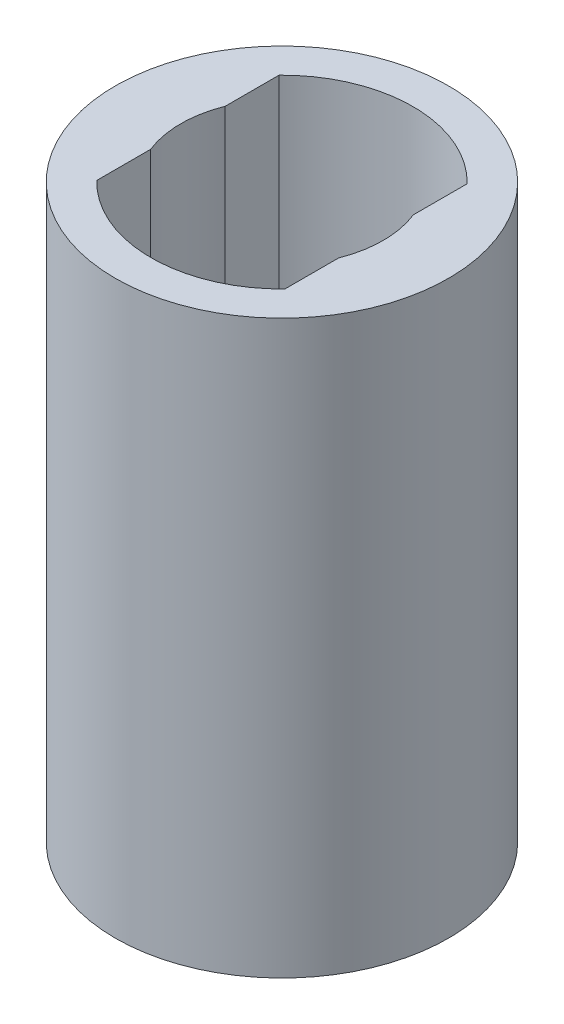
ISO-10303-21;
HEADER;
FILE_DESCRIPTION(('STEP AP214'),'2;1');
FILE_NAME('part.step','',(''),(''),'','','');
FILE_SCHEMA(('AUTOMOTIVE_DESIGN { 1 0 10303 214 1 1 1 1 }'));
ENDSEC;
DATA;
#1=APPLICATION_CONTEXT('core data for automotive mechanical design processes');
#2=APPLICATION_PROTOCOL_DEFINITION('international standard','automotive_design',2000,#1);
#3=PRODUCT_CONTEXT('',#1,'mechanical');
#4=PRODUCT('Part','Part','',(#3));
#5=PRODUCT_RELATED_PRODUCT_CATEGORY('part','',(#4));
#6=PRODUCT_DEFINITION_FORMATION('','',#4);
#7=PRODUCT_DEFINITION_CONTEXT('part definition',#1,'design');
#8=PRODUCT_DEFINITION('design','',#6,#7);
#9=PRODUCT_DEFINITION_SHAPE('','',#8);
#10=(LENGTH_UNIT() NAMED_UNIT(*) SI_UNIT(.MILLI.,.METRE.));
#11=(NAMED_UNIT(*) PLANE_ANGLE_UNIT() SI_UNIT($,.RADIAN.));
#12=(NAMED_UNIT(*) SI_UNIT($,.STERADIAN.) SOLID_ANGLE_UNIT());
#13=UNCERTAINTY_MEASURE_WITH_UNIT(LENGTH_MEASURE(1.E-05),#10,'distance_accuracy_value','');
#14=(GEOMETRIC_REPRESENTATION_CONTEXT(3) GLOBAL_UNCERTAINTY_ASSIGNED_CONTEXT((#13)) GLOBAL_UNIT_ASSIGNED_CONTEXT((#10,
#11,#12)) REPRESENTATION_CONTEXT('',''));
#15=CARTESIAN_POINT('',(0.,0.,0.));
#16=DIRECTION('',(0.,0.,1.));
#17=DIRECTION('',(1.,0.,0.));
#18=AXIS2_PLACEMENT_3D('',#15,#16,#17);
#19=CARTESIAN_POINT('',(0.,12.,0.));
#20=DIRECTION('',(0.,1.,0.));
#21=DIRECTION('',(0.,0.,1.));
#22=AXIS2_PLACEMENT_3D('',#19,#20,#21);
#23=PLANE('',#22);
#24=CARTESIAN_POINT('',(0.,12.,0.));
#25=DIRECTION('',(0.,1.,0.));
#26=DIRECTION('',(0.,0.,1.));
#27=AXIS2_PLACEMENT_3D('',#24,#25,#26);
#28=CIRCLE('',#27,3.5);
#29=CARTESIAN_POINT('',(0.,12.,3.5));
#30=VERTEX_POINT('',#29);
#31=EDGE_CURVE('E205',#30,#30,#28,.T.);
#32=ORIENTED_EDGE('',*,*,#31,.T.);
#33=EDGE_LOOP('',(#32));
#34=FACE_BOUND('',#33,.T.);
#35=CARTESIAN_POINT('',(0.,12.,0.));
#36=DIRECTION('',(0.,1.,0.));
#37=DIRECTION('',(0.,0.,1.));
#38=AXIS2_PLACEMENT_3D('',#35,#36,#37);
#39=CIRCLE('',#38,2.125);
#40=CARTESIAN_POINT('',(1.975,12.,0.784219357067906));
#41=VERTEX_POINT('',#40);
#42=CARTESIAN_POINT('',(1.975,12.,-0.784219357067906));
#43=VERTEX_POINT('',#42);
#44=EDGE_CURVE('E227',#41,#43,#39,.T.);
#45=ORIENTED_EDGE('',*,*,#44,.F.);
#46=DIRECTION('',(0.,0.,1.));
#47=VECTOR('',#46,1.);
#48=CARTESIAN_POINT('',(1.975,12.,-1.91360262332596));
#49=LINE('',#48,#47);
#50=CARTESIAN_POINT('',(1.975,12.,1.91360262332596));
#51=VERTEX_POINT('',#50);
#52=EDGE_CURVE('E151',#41,#51,#49,.T.);
#53=ORIENTED_EDGE('',*,*,#52,.T.);
#54=CARTESIAN_POINT('',(0.,12.,0.));
#55=DIRECTION('',(0.,1.,0.));
#56=DIRECTION('',(0.,0.,1.));
#57=AXIS2_PLACEMENT_3D('',#54,#55,#56);
#58=CIRCLE('',#57,2.75);
#59=CARTESIAN_POINT('',(-1.975,12.,1.91360262332596));
#60=VERTEX_POINT('',#59);
#61=EDGE_CURVE('E125',#60,#51,#58,.T.);
#62=ORIENTED_EDGE('',*,*,#61,.F.);
#63=DIRECTION('',(0.,0.,1.));
#64=VECTOR('',#63,1.);
#65=CARTESIAN_POINT('',(-1.975,12.,-1.91360262332596));
#66=LINE('',#65,#64);
#67=CARTESIAN_POINT('',(-1.975,12.,0.784219357067906));
#68=VERTEX_POINT('',#67);
#69=EDGE_CURVE('E154',#68,#60,#66,.T.);
#70=ORIENTED_EDGE('',*,*,#69,.F.);
#71=CARTESIAN_POINT('',(-1.975,12.,-0.784219357067906));
#72=VERTEX_POINT('',#71);
#73=EDGE_CURVE('E176',#72,#68,#39,.T.);
#74=ORIENTED_EDGE('',*,*,#73,.F.);
#75=CARTESIAN_POINT('',(-1.975,12.,-1.91360262332596));
#76=VERTEX_POINT('',#75);
#77=EDGE_CURVE('E155',#76,#72,#66,.T.);
#78=ORIENTED_EDGE('',*,*,#77,.F.);
#79=CARTESIAN_POINT('',(0.,12.,0.));
#80=DIRECTION('',(0.,1.,0.));
#81=DIRECTION('',(0.,0.,1.));
#82=AXIS2_PLACEMENT_3D('',#79,#80,#81);
#83=CIRCLE('',#82,2.75);
#84=CARTESIAN_POINT('',(1.975,12.,-1.91360262332596));
#85=VERTEX_POINT('',#84);
#86=EDGE_CURVE('E117',#85,#76,#83,.T.);
#87=ORIENTED_EDGE('',*,*,#86,.F.);
#88=EDGE_CURVE('E147',#85,#43,#49,.T.);
#89=ORIENTED_EDGE('',*,*,#88,.T.);
#90=EDGE_LOOP('',(#45,#53,#62,#70,#74,#78,#87,#89));
#91=FACE_BOUND('',#90,.T.);
#92=ADVANCED_FACE('F43',(#34,#91),#23,.T.);
#93=CARTESIAN_POINT('',(0.,0.,0.));
#94=DIRECTION('',(0.,1.,0.));
#95=DIRECTION('',(0.,0.,1.));
#96=AXIS2_PLACEMENT_3D('',#93,#94,#95);
#97=CYLINDRICAL_SURFACE('',#96,2.125);
#98=CARTESIAN_POINT('',(-1.50519932234904,2.69220121742679,-1.5));
#99=CARTESIAN_POINT('',(-1.50520214720211,2.62041917817583,-1.49999869556422));
#100=CARTESIAN_POINT('',(-1.51043595896016,2.54863058740705,-1.49479928653075));
#101=CARTESIAN_POINT('',(-1.53024145830286,2.4077305705508,-1.47450715955429));
#102=CARTESIAN_POINT('',(-1.54483464329734,2.338625697199,-1.45939166366113));
#103=CARTESIAN_POINT('',(-1.58058723578831,2.20568030383637,-1.42058027569236));
#104=CARTESIAN_POINT('',(-1.60167064810974,2.14178915636918,-1.39698318609836));
#105=CARTESIAN_POINT('',(-1.64789262205342,2.01902779024584,-1.34214779894104));
#106=CARTESIAN_POINT('',(-1.67303130718039,1.96015772459195,-1.31090926864008));
#107=CARTESIAN_POINT('',(-1.72989468853986,1.83758581985222,-1.2351963671847));
#108=CARTESIAN_POINT('',(-1.76199325354786,1.77490237479904,-1.18935407137766));
#109=CARTESIAN_POINT('',(-1.8260366691656,1.6572043058703,-1.08848290599274));
#110=CARTESIAN_POINT('',(-1.85798127145173,1.60219956687641,-1.03344239199102));
#111=CARTESIAN_POINT('',(-1.92450086438534,1.4920677111538,-0.904458074000193));
#112=CARTESIAN_POINT('',(-1.95859449433922,1.43852144621071,-0.828891282149028));
#113=CARTESIAN_POINT('',(-2.01945562578145,1.34542280312454,-0.666975493946208));
#114=CARTESIAN_POINT('',(-2.04623805843333,1.30584185543617,-0.580649004938953));
#115=CARTESIAN_POINT('',(-2.08327979379691,1.25182022115827,-0.424445047264864));
#116=CARTESIAN_POINT('',(-2.09605358148365,1.23346665741796,-0.356506608089566));
#117=CARTESIAN_POINT('',(-2.11495838497326,1.20642872578648,-0.217843670146032));
#118=CARTESIAN_POINT('',(-2.12109475724751,1.19773656087757,-0.147121465753948));
#119=CARTESIAN_POINT('',(-2.12619071017568,1.1905127000863,-0.0047540807310221));
#120=CARTESIAN_POINT('',(-2.12513583137594,1.1920014750458,0.0668926701829182));
#121=CARTESIAN_POINT('',(-2.11591327195684,1.20509489975773,0.208792848174512));
#122=CARTESIAN_POINT('',(-2.10774364231233,1.21670232142774,0.279045888062876));
#123=CARTESIAN_POINT('',(-2.08527950768666,1.24897722951158,0.414538535006281));
#124=CARTESIAN_POINT('',(-2.07113741808345,1.26941953681858,0.479858177315479));
#125=CARTESIAN_POINT('',(-2.03780819788247,1.31838959997912,0.605989844868525));
#126=CARTESIAN_POINT('',(-2.01862006287128,1.34691896564671,0.666800969600958));
#127=CARTESIAN_POINT('',(-1.97405855044121,1.41470052132768,0.789586818293232));
#128=CARTESIAN_POINT('',(-1.94823316370999,1.45479569918684,0.850929326950898));
#129=CARTESIAN_POINT('',(-1.89362450736713,1.54269023833625,0.966384529138026));
#130=CARTESIAN_POINT('',(-1.86483813811931,1.59049770342029,1.02048950712952));
#131=CARTESIAN_POINT('',(-1.80085660723649,1.70228330257195,1.13015943797248));
#132=CARTESIAN_POINT('',(-1.76544477380881,1.76762203661552,1.18421498663101));
#133=CARTESIAN_POINT('',(-1.69653041251856,1.90716869114833,1.28098841502435));
#134=CARTESIAN_POINT('',(-1.66302755110806,1.98137505516664,1.32370828020276));
#135=CARTESIAN_POINT('',(-1.60928205888531,2.12014280647028,1.38822895892572));
#136=CARTESIAN_POINT('',(-1.58776035949452,2.18301444787746,1.41258034760095));
#137=CARTESIAN_POINT('',(-1.55095901708055,2.31309783651596,1.45289355014794));
#138=CARTESIAN_POINT('',(-1.5356677294213,2.38030121280369,1.46887103100747));
#139=CARTESIAN_POINT('',(-1.51364914591407,2.51847449835732,1.49156254183296));
#140=CARTESIAN_POINT('',(-1.5070153687162,2.58947705028718,1.49817547967281));
#141=CARTESIAN_POINT('',(-1.50404287364788,2.73190355970013,1.50116249007311));
#142=CARTESIAN_POINT('',(-1.50769903283174,2.80332728982668,1.49754165761262));
#143=CARTESIAN_POINT('',(-1.52323393233648,2.93342095217929,1.48171228745719));
#144=CARTESIAN_POINT('',(-1.53382763612406,2.9924246760013,1.47084159355773));
#145=CARTESIAN_POINT('',(-1.56045447769576,3.10757666696781,1.4425616074715));
#146=CARTESIAN_POINT('',(-1.57649360284325,3.16372171245261,1.42514511576736));
#147=CARTESIAN_POINT('',(-1.62090415298206,3.29839184941678,1.3747308627526));
#148=CARTESIAN_POINT('',(-1.6515142548013,3.37487613642098,1.33826170669245));
#149=CARTESIAN_POINT('',(-1.71640737292594,3.51962435211473,1.25395818007408));
#150=CARTESIAN_POINT('',(-1.75069757289014,3.58787162954087,1.2061013505002));
#151=CARTESIAN_POINT('',(-1.8200427492385,3.71686599410408,1.09874471422828));
#152=CARTESIAN_POINT('',(-1.85509906339844,3.77743178177559,1.03902740697382));
#153=CARTESIAN_POINT('',(-1.92203978164134,3.88825929404485,0.909233916090093));
#154=CARTESIAN_POINT('',(-1.95392869023993,3.93853576276166,0.839172806193109));
#155=CARTESIAN_POINT('',(-2.00710239176216,4.02022034779928,0.701245398051936));
#156=CARTESIAN_POINT('',(-2.02926536113011,4.05334831581606,0.634741202873395));
#157=CARTESIAN_POINT('',(-2.06754330388442,4.109784267101,0.496036748971944));
#158=CARTESIAN_POINT('',(-2.08366185989883,4.13309806840273,0.423839895198628));
#159=CARTESIAN_POINT('',(-2.10848103370621,4.16876251670421,0.275043557722843));
#160=CARTESIAN_POINT('',(-2.11713677493095,4.18104685764086,0.198420355573291));
#161=CARTESIAN_POINT('',(-2.12595995708904,4.19356792341956,0.0437162428034949));
#162=CARTESIAN_POINT('',(-2.12613117331417,4.19381000660968,-0.0343640040149553));
#163=CARTESIAN_POINT('',(-2.11840035054256,4.18284053204754,-0.181299140135758));
#164=CARTESIAN_POINT('',(-2.11131260076514,4.17278422630034,-0.250288774657608));
#165=CARTESIAN_POINT('',(-2.09088925361572,4.1435118670639,-0.385320835037221));
#166=CARTESIAN_POINT('',(-2.07755251542591,4.12429414105097,-0.451362720340538));
#167=CARTESIAN_POINT('',(-2.04515450939805,4.0768818878364,-0.581008837193009));
#168=CARTESIAN_POINT('',(-2.02593186295436,4.04843273752588,-0.644478353074757));
#169=CARTESIAN_POINT('',(-1.98326563201058,3.98383007000776,-0.765782420347459));
#170=CARTESIAN_POINT('',(-1.95982125962299,3.94767511445822,-0.823615916795444));
#171=CARTESIAN_POINT('',(-1.90625355087688,3.86243528971162,-0.941618357635264));
#172=CARTESIAN_POINT('',(-1.87565857831831,3.8122139125918,-1.00075071260575));
#173=CARTESIAN_POINT('',(-1.81294867065013,3.70369583658326,-1.11033351316612));
#174=CARTESIAN_POINT('',(-1.78083078494166,3.64538300163301,-1.16076614733902));
#175=CARTESIAN_POINT('',(-1.71244584101859,3.51118373850898,-1.25989430283723));
#176=CARTESIAN_POINT('',(-1.676360380328,3.43398319387633,-1.30695360256659));
#177=CARTESIAN_POINT('',(-1.61062514198581,3.27018212272423,-1.38715592572015));
#178=CARTESIAN_POINT('',(-1.58095906248886,3.18360626481372,-1.42033440420439));
#179=CARTESIAN_POINT('',(-1.54120225956538,3.02908366652443,-1.46318771508161));
#180=CARTESIAN_POINT('',(-1.52792365333072,2.96309804262376,-1.47689912451371));
#181=CARTESIAN_POINT('',(-1.50993055372185,2.82880691389304,-1.49529564966024));
#182=CARTESIAN_POINT('',(-1.50519663429654,2.76050703182757,-1.50000124126521));
#183=CARTESIAN_POINT('',(-1.50519932234904,2.69220121742679,-1.5));
#184=B_SPLINE_CURVE_WITH_KNOTS('',3,(#98,#99,#100,#101,#102,#103,#104,#105,#106,#107,#108,#109,
#110,#111,#112,#113,#114,#115,#116,#117,#118,#119,#120,#121,#122,#123,#124,#125,#126,#127,#128,
#129,#130,#131,#132,#133,#134,#135,#136,#137,#138,#139,#140,#141,#142,#143,#144,#145,#146,#147,
#148,#149,#150,#151,#152,#153,#154,#155,#156,#157,#158,#159,#160,#161,#162,#163,#164,#165,#166,
#167,#168,#169,#170,#171,#172,#173,#174,#175,#176,#177,#178,#179,#180,#181,#182,#183),
.UNSPECIFIED.,.T.,.F.,(4,2,2,2,2,2,2,2,2,2,2,2,2,2,2,2,2,2,2,2,2,2,2,2,2,2,2,2,2,2,2,2,2,2,2,2,
2,2,2,2,2,2,4),(0.,0.215021266133692,0.430538188916603,0.643621850137448,0.856712002119262,
1.10790624761036,1.35942093373229,1.6538555127781,1.94768421142553,2.16133805058834,
2.37481933968129,2.58873000218012,2.80269928211445,3.01150990409877,3.22036212125895,
3.45260115368762,3.68508582334802,3.95966466351125,4.23419537943179,4.44577979945356,
4.65696693403321,4.87041693558593,5.08376068776422,5.26580461447219,5.4480493543214,
5.7168815364825,5.98624837506959,6.26110751539386,6.53556999411487,6.76722349378129,
6.998739470581,7.23163811483232,7.46443312709081,7.6736973954055,7.88299988198214,
8.09865145849966,8.31434332318605,8.56359350252857,8.81334808019983,9.10399265701981,
9.3938902549199,9.59896539960113,9.80357372293672),.UNSPECIFIED.);
#185=CARTESIAN_POINT('',(-1.50519932234904,2.69220121742679,-1.5));
#186=VERTEX_POINT('',#185);
#187=EDGE_CURVE('E128',#186,#186,#184,.T.);
#188=ORIENTED_EDGE('',*,*,#187,.T.);
#189=EDGE_LOOP('',(#188));
#190=FACE_BOUND('',#189,.T.);
#191=CARTESIAN_POINT('',(0.,0.,0.));
#192=DIRECTION('',(0.,1.,0.));
#193=DIRECTION('',(0.,0.,1.));
#194=AXIS2_PLACEMENT_3D('',#191,#192,#193);
#195=CIRCLE('',#194,2.125);
#196=CARTESIAN_POINT('',(0.,0.,2.125));
#197=VERTEX_POINT('',#196);
#198=EDGE_CURVE('E177',#197,#197,#195,.T.);
#199=ORIENTED_EDGE('',*,*,#198,.F.);
#200=EDGE_LOOP('',(#199));
#201=FACE_BOUND('',#200,.T.);
#202=DIRECTION('',(0.,1.,0.));
#203=VECTOR('',#202,1.);
#204=CARTESIAN_POINT('',(1.975,0.,-0.784219357067906));
#205=LINE('',#204,#203);
#206=CARTESIAN_POINT('',(1.975,7.,-0.784219357067906));
#207=VERTEX_POINT('',#206);
#208=EDGE_CURVE('E11',#207,#43,#205,.T.);
#209=ORIENTED_EDGE('',*,*,#208,.F.);
#210=CARTESIAN_POINT('',(0.,7.,0.));
#211=DIRECTION('',(0.,1.,0.));
#212=DIRECTION('',(0.,0.,1.));
#213=AXIS2_PLACEMENT_3D('',#210,#211,#212);
#214=CIRCLE('',#213,2.125);
#215=CARTESIAN_POINT('',(-1.975,7.,-0.784219357067906));
#216=VERTEX_POINT('',#215);
#217=EDGE_CURVE('E206',#216,#207,#214,.F.);
#218=ORIENTED_EDGE('',*,*,#217,.F.);
#219=DIRECTION('',(0.,1.,0.));
#220=VECTOR('',#219,1.);
#221=CARTESIAN_POINT('',(-1.975,0.,-0.784219357067906));
#222=LINE('',#221,#220);
#223=EDGE_CURVE('E53',#216,#72,#222,.T.);
#224=ORIENTED_EDGE('',*,*,#223,.T.);
#225=ORIENTED_EDGE('',*,*,#73,.T.);
#226=DIRECTION('',(0.,1.,0.));
#227=VECTOR('',#226,1.);
#228=CARTESIAN_POINT('',(-1.975,0.,0.784219357067906));
#229=LINE('',#228,#227);
#230=CARTESIAN_POINT('',(-1.975,7.,0.784219357067906));
#231=VERTEX_POINT('',#230);
#232=EDGE_CURVE('E204',#68,#231,#229,.F.);
#233=ORIENTED_EDGE('',*,*,#232,.T.);
#234=CARTESIAN_POINT('',(1.975,7.,0.784219357067906));
#235=VERTEX_POINT('',#234);
#236=EDGE_CURVE('E201',#235,#231,#214,.F.);
#237=ORIENTED_EDGE('',*,*,#236,.F.);
#238=DIRECTION('',(0.,1.,0.));
#239=VECTOR('',#238,1.);
#240=CARTESIAN_POINT('',(1.975,0.,0.784219357067906));
#241=LINE('',#240,#239);
#242=EDGE_CURVE('E113',#41,#235,#241,.F.);
#243=ORIENTED_EDGE('',*,*,#242,.F.);
#244=ORIENTED_EDGE('',*,*,#44,.T.);
#245=EDGE_LOOP('',(#209,#218,#224,#225,#233,#237,#243,#244));
#246=FACE_BOUND('',#245,.T.);
#247=ADVANCED_FACE('F187',(#190,#201,#246),#97,.F.);
#248=CARTESIAN_POINT('',(0.,12.,0.));
#249=DIRECTION('',(0.,-1.,0.));
#250=DIRECTION('',(0.,0.,-1.));
#251=AXIS2_PLACEMENT_3D('',#248,#249,#250);
#252=CYLINDRICAL_SURFACE('',#251,3.5);
#253=CARTESIAN_POINT('',(-3.16227766016838,2.69220121742679,-1.5));
#254=CARTESIAN_POINT('',(-3.16228717298615,2.77197015047217,-1.49999038492545));
#255=CARTESIAN_POINT('',(-3.16534018013075,2.8518593590687,-1.49359660659694));
#256=CARTESIAN_POINT('',(-3.17716042981265,3.00931788050042,-1.46827542593982));
#257=CARTESIAN_POINT('',(-3.18594276667924,3.08688049756534,-1.44931491353816));
#258=CARTESIAN_POINT('',(-3.20802619745321,3.23711715922459,-1.39974825661799));
#259=CARTESIAN_POINT('',(-3.22130811955254,3.30981040277115,-1.3691914561727));
#260=CARTESIAN_POINT('',(-3.25086693275557,3.44901914686244,-1.29744502147729));
#261=CARTESIAN_POINT('',(-3.26714323581242,3.51553585652355,-1.25625747429105));
#262=CARTESIAN_POINT('',(-3.3020556513051,3.64492613304332,-1.16151711863134));
#263=CARTESIAN_POINT('',(-3.32077467653238,3.70734394824213,-1.10737213961854));
#264=CARTESIAN_POINT('',(-3.35778390832689,3.82255254982721,-0.989495816865005));
#265=CARTESIAN_POINT('',(-3.37607394135677,3.87533949689797,-0.925760668427734));
#266=CARTESIAN_POINT('',(-3.41118222051011,3.97216072206252,-0.786887444118555));
#267=CARTESIAN_POINT('',(-3.42789293367331,4.01567581255739,-0.711357726755067));
#268=CARTESIAN_POINT('',(-3.4569371087723,4.08918333164265,-0.553203581147163));
#269=CARTESIAN_POINT('',(-3.46927262014747,4.11918209335939,-0.470582497238455));
#270=CARTESIAN_POINT('',(-3.48758735586712,4.16313372798789,-0.305382130945827));
#271=CARTESIAN_POINT('',(-3.49387724164572,4.17787424990965,-0.223047558846187));
#272=CARTESIAN_POINT('',(-3.50052462942354,4.19344256782117,-0.0568497000057554));
#273=CARTESIAN_POINT('',(-3.50088468598068,4.19427635480495,0.0270129128697493));
#274=CARTESIAN_POINT('',(-3.49581016618033,4.1824060930366,0.188134207596874));
#275=CARTESIAN_POINT('',(-3.49074679776828,4.17056931745229,0.265470719086093));
#276=CARTESIAN_POINT('',(-3.47591102813446,4.13518918309936,0.416935858912367));
#277=CARTESIAN_POINT('',(-3.46613827891648,4.11164495921342,0.491064249746499));
#278=CARTESIAN_POINT('',(-3.44263346664963,4.05324792256398,0.635378985342392));
#279=CARTESIAN_POINT('',(-3.42884310391306,4.01822757125196,0.70548764730497));
#280=CARTESIAN_POINT('',(-3.39863837501696,3.93804253974891,0.839017665141777));
#281=CARTESIAN_POINT('',(-3.38222306678434,3.89287421516102,0.902436606512514));
#282=CARTESIAN_POINT('',(-3.34696895152063,3.78979646408386,1.02577392003805));
#283=CARTESIAN_POINT('',(-3.32804069559209,3.73119178253121,1.08508648843663));
#284=CARTESIAN_POINT('',(-3.29078815665823,3.60484980161061,1.19331308888253));
#285=CARTESIAN_POINT('',(-3.27246413723674,3.53710858055285,1.24222263226406));
#286=CARTESIAN_POINT('',(-3.23783417736942,3.3913112801656,1.32993971380651));
#287=CARTESIAN_POINT('',(-3.22162619167355,3.3129691445818,1.36831384702014));
#288=CARTESIAN_POINT('',(-3.19424697319981,3.15005671314774,1.43107385954865));
#289=CARTESIAN_POINT('',(-3.18307189830842,3.06549122576628,1.45547041320372));
#290=CARTESIAN_POINT('',(-3.16799275229804,2.89861481964321,1.48799335058118));
#291=CARTESIAN_POINT('',(-3.16364898851198,2.81653672712914,1.49710640039855));
#292=CARTESIAN_POINT('',(-3.16146494308516,2.65192672986664,1.50171565988816));
#293=CARTESIAN_POINT('',(-3.16362218505066,2.56939500987147,1.49721705457354));
#294=CARTESIAN_POINT('',(-3.17374071577831,2.41226993055654,1.47563239208818));
#295=CARTESIAN_POINT('',(-3.18128847435202,2.3375233472414,1.45944230541441));
#296=CARTESIAN_POINT('',(-3.2007978650071,2.19187847924145,1.41614006363835));
#297=CARTESIAN_POINT('',(-3.21276056926751,2.12098113415402,1.38902525529709));
#298=CARTESIAN_POINT('',(-3.24038333624188,1.98159627228177,1.32334189052693));
#299=CARTESIAN_POINT('',(-3.25618154123646,1.91334755651745,1.28432659707742));
#300=CARTESIAN_POINT('',(-3.28950916992049,1.78402586466946,1.19638562157086));
#301=CARTESIAN_POINT('',(-3.3070393706057,1.72295613632155,1.14745548114547));
#302=CARTESIAN_POINT('',(-3.34369698282831,1.60418675464718,1.03605747720159));
#303=CARTESIAN_POINT('',(-3.36283055507213,1.54724359884104,0.972781802419173));
#304=CARTESIAN_POINT('',(-3.39913473749074,1.44463409876325,0.83714233452468));
#305=CARTESIAN_POINT('',(-3.41630515097051,1.39896888393294,0.764777632276176));
#306=CARTESIAN_POINT('',(-3.44690719585056,1.32015987262154,0.612290393672595));
#307=CARTESIAN_POINT('',(-3.46032004460384,1.28707869465091,0.532131490582581));
#308=CARTESIAN_POINT('',(-3.48173830246699,1.23512631798119,0.366659881518581));
#309=CARTESIAN_POINT('',(-3.48974713693762,1.21624611705129,0.281350477650409));
#310=CARTESIAN_POINT('',(-3.49904040627988,1.1944124886194,0.114740191834881));
#311=CARTESIAN_POINT('',(-3.50077418524232,1.19039431174905,0.0336030421543032));
#312=CARTESIAN_POINT('',(-3.49858700907225,1.19549897221588,-0.128169808807151));
#313=CARTESIAN_POINT('',(-3.49466715001972,1.20461926237669,-0.208805604242758));
#314=CARTESIAN_POINT('',(-3.48185611932799,1.23497798589783,-0.364022405138258));
#315=CARTESIAN_POINT('',(-3.47316550610207,1.2557282011366,-0.438716867066028));
#316=CARTESIAN_POINT('',(-3.45179100848821,1.30820924934856,-0.583524431853923));
#317=CARTESIAN_POINT('',(-3.43910638916064,1.3399421033508,-0.653636688669972));
#318=CARTESIAN_POINT('',(-3.41024047270082,1.41509639533878,-0.790820855389581));
#319=CARTESIAN_POINT('',(-3.39392604407178,1.45898507003996,-0.85760809936612));
#320=CARTESIAN_POINT('',(-3.35970811620735,1.55654118215599,-0.98315957617543));
#321=CARTESIAN_POINT('',(-3.341803989688,1.61021248860453,-1.0419206185));
#322=CARTESIAN_POINT('',(-3.30477972078024,1.73039672603616,-1.15419921481671));
#323=CARTESIAN_POINT('',(-3.28566570654981,1.7975592255469,-1.20702595263291));
#324=CARTESIAN_POINT('',(-3.24969238680823,1.94036047496898,-1.30078077887623));
#325=CARTESIAN_POINT('',(-3.23283439654742,2.01600412253005,-1.34170194259386));
#326=CARTESIAN_POINT('',(-3.20355631016088,2.17377478734209,-1.41018371094567));
#327=CARTESIAN_POINT('',(-3.19112824877803,2.25588984056185,-1.43776832759537));
#328=CARTESIAN_POINT('',(-3.17252771438391,2.42415639734227,-1.47837340972956));
#329=CARTESIAN_POINT('',(-3.16633426473114,2.51029333838007,-1.49144272805064));
#330=CARTESIAN_POINT('',(-3.16275406284903,2.62860006234846,-1.49899243118201));
#331=CARTESIAN_POINT('',(-3.16227386666053,2.66039107651716,-1.50000383428566));
#332=CARTESIAN_POINT('',(-3.16227766016838,2.69220121742679,-1.5));
#333=B_SPLINE_CURVE_WITH_KNOTS('',3,(#253,#254,#255,#256,#257,#258,#259,#260,#261,#262,#263,
#264,#265,#266,#267,#268,#269,#270,#271,#272,#273,#274,#275,#276,#277,#278,#279,#280,#281,#282,
#283,#284,#285,#286,#287,#288,#289,#290,#291,#292,#293,#294,#295,#296,#297,#298,#299,#300,#301,
#302,#303,#304,#305,#306,#307,#308,#309,#310,#311,#312,#313,#314,#315,#316,#317,#318,#319,#320,
#321,#322,#323,#324,#325,#326,#327,#328,#329,#330,#331,#332),.UNSPECIFIED.,.T.,.F.,(4,2,2,2,2,2,
2,2,2,2,2,2,2,2,2,2,2,2,2,2,2,2,2,2,2,2,2,2,2,2,2,2,2,2,2,2,2,2,2,4),(0.,0.239211516998636,
0.479055812925296,0.717890772651921,0.956678879115817,1.20974703533054,1.46291585698786,
1.72782087173741,1.992601634844,2.24290515697656,2.49310084605822,2.72720452587285,
2.96132550725882,3.19902917219044,3.43681833943188,3.69219429883402,3.94768022455396,
4.21248245374587,4.47708218938959,4.72382987542101,4.97048358104408,5.20000580849601,
5.42958381263239,5.66914358774548,5.9088113247203,6.16934837221378,6.42991150089539,
6.69175474679387,6.95343186577332,7.19595274449671,7.43842661162275,7.67141114258535,
7.90443857025996,8.14809791325949,8.39185383353303,8.65331392763672,8.91492579368383,
9.17606486564864,9.43632235654433,9.53171478279883),.UNSPECIFIED.);
#334=CARTESIAN_POINT('',(-3.16227766016838,2.69220121742679,-1.5));
#335=VERTEX_POINT('',#334);
#336=EDGE_CURVE('E168',#335,#335,#333,.T.);
#337=ORIENTED_EDGE('',*,*,#336,.T.);
#338=EDGE_LOOP('',(#337));
#339=FACE_BOUND('',#338,.T.);
#340=ORIENTED_EDGE('',*,*,#31,.F.);
#341=EDGE_LOOP('',(#340));
#342=FACE_BOUND('',#341,.T.);
#343=CARTESIAN_POINT('',(0.,0.,0.));
#344=DIRECTION('',(0.,1.,0.));
#345=DIRECTION('',(0.,0.,1.));
#346=AXIS2_PLACEMENT_3D('',#343,#344,#345);
#347=CIRCLE('',#346,3.5);
#348=CARTESIAN_POINT('',(0.,0.,3.5));
#349=VERTEX_POINT('',#348);
#350=EDGE_CURVE('E199',#349,#349,#347,.T.);
#351=ORIENTED_EDGE('',*,*,#350,.T.);
#352=EDGE_LOOP('',(#351));
#353=FACE_BOUND('',#352,.T.);
#354=ADVANCED_FACE('F45',(#339,#342,#353),#252,.T.);
#355=CARTESIAN_POINT('',(0.,0.,0.));
#356=DIRECTION('',(0.,1.,0.));
#357=DIRECTION('',(0.,0.,1.));
#358=AXIS2_PLACEMENT_3D('',#355,#356,#357);
#359=PLANE('',#358);
#360=ORIENTED_EDGE('',*,*,#198,.T.);
#361=EDGE_LOOP('',(#360));
#362=FACE_BOUND('',#361,.T.);
#363=ORIENTED_EDGE('',*,*,#350,.F.);
#364=EDGE_LOOP('',(#363));
#365=FACE_BOUND('',#364,.T.);
#366=ADVANCED_FACE('F184',(#362,#365),#359,.F.);
#367=CARTESIAN_POINT('',(-12.,2.69220121742679,0.));
#368=DIRECTION('',(1.,0.,0.));
#369=DIRECTION('',(0.,0.,-1.));
#370=AXIS2_PLACEMENT_3D('',#367,#368,#369);
#371=CYLINDRICAL_SURFACE('',#370,1.5);
#372=ORIENTED_EDGE('',*,*,#187,.F.);
#373=EDGE_LOOP('',(#372));
#374=FACE_BOUND('',#373,.T.);
#375=ORIENTED_EDGE('',*,*,#336,.F.);
#376=EDGE_LOOP('',(#375));
#377=FACE_BOUND('',#376,.T.);
#378=ADVANCED_FACE('F179',(#374,#377),#371,.F.);
#379=CARTESIAN_POINT('',(0.,7.,0.));
#380=DIRECTION('',(0.,1.,0.));
#381=DIRECTION('',(0.,0.,1.));
#382=AXIS2_PLACEMENT_3D('',#379,#380,#381);
#383=PLANE('',#382);
#384=ORIENTED_EDGE('',*,*,#236,.T.);
#385=DIRECTION('',(0.,0.,1.));
#386=VECTOR('',#385,1.);
#387=CARTESIAN_POINT('',(-1.975,7.,-1.91360262332596));
#388=LINE('',#387,#386);
#389=CARTESIAN_POINT('',(-1.975,7.,1.91360262332596));
#390=VERTEX_POINT('',#389);
#391=EDGE_CURVE('E133',#231,#390,#388,.T.);
#392=ORIENTED_EDGE('',*,*,#391,.T.);
#393=CARTESIAN_POINT('',(0.,7.,0.));
#394=DIRECTION('',(0.,1.,0.));
#395=DIRECTION('',(0.,0.,1.));
#396=AXIS2_PLACEMENT_3D('',#393,#394,#395);
#397=CIRCLE('',#396,2.75);
#398=CARTESIAN_POINT('',(1.975,7.,1.91360262332596));
#399=VERTEX_POINT('',#398);
#400=EDGE_CURVE('E123',#390,#399,#397,.T.);
#401=ORIENTED_EDGE('',*,*,#400,.T.);
#402=DIRECTION('',(0.,0.,1.));
#403=VECTOR('',#402,1.);
#404=CARTESIAN_POINT('',(1.975,7.,-1.91360262332596));
#405=LINE('',#404,#403);
#406=EDGE_CURVE('E68',#235,#399,#405,.T.);
#407=ORIENTED_EDGE('',*,*,#406,.F.);
#408=EDGE_LOOP('',(#384,#392,#401,#407));
#409=FACE_BOUND('',#408,.T.);
#410=ADVANCED_FACE('F131',(#409),#383,.T.);
#411=CARTESIAN_POINT('',(-1.975,7.,-1.91360262332596));
#412=DIRECTION('',(-1.,0.,0.));
#413=DIRECTION('',(0.,0.,1.));
#414=AXIS2_PLACEMENT_3D('',#411,#412,#413);
#415=PLANE('',#414);
#416=ORIENTED_EDGE('',*,*,#69,.T.);
#417=DIRECTION('',(0.,1.,0.));
#418=VECTOR('',#417,1.);
#419=CARTESIAN_POINT('',(-1.975,7.,1.91360262332596));
#420=LINE('',#419,#418);
#421=EDGE_CURVE('E129',#390,#60,#420,.T.);
#422=ORIENTED_EDGE('',*,*,#421,.F.);
#423=ORIENTED_EDGE('',*,*,#391,.F.);
#424=ORIENTED_EDGE('',*,*,#232,.F.);
#425=EDGE_LOOP('',(#416,#422,#423,#424));
#426=FACE_BOUND('',#425,.T.);
#427=ADVANCED_FACE('F295',(#426),#415,.F.);
#428=CARTESIAN_POINT('',(1.975,7.,-1.91360262332596));
#429=DIRECTION('',(-1.,0.,0.));
#430=DIRECTION('',(0.,0.,1.));
#431=AXIS2_PLACEMENT_3D('',#428,#429,#430);
#432=PLANE('',#431);
#433=ORIENTED_EDGE('',*,*,#242,.T.);
#434=ORIENTED_EDGE('',*,*,#406,.T.);
#435=DIRECTION('',(0.,1.,0.));
#436=VECTOR('',#435,1.);
#437=CARTESIAN_POINT('',(1.975,7.,1.91360262332596));
#438=LINE('',#437,#436);
#439=EDGE_CURVE('E110',#399,#51,#438,.T.);
#440=ORIENTED_EDGE('',*,*,#439,.T.);
#441=ORIENTED_EDGE('',*,*,#52,.F.);
#442=EDGE_LOOP('',(#433,#434,#440,#441));
#443=FACE_BOUND('',#442,.T.);
#444=ADVANCED_FACE('F109',(#443),#432,.T.);
#445=CARTESIAN_POINT('',(0.,7.,0.));
#446=DIRECTION('',(0.,1.,0.));
#447=DIRECTION('',(0.,0.,1.));
#448=AXIS2_PLACEMENT_3D('',#445,#446,#447);
#449=CYLINDRICAL_SURFACE('',#448,2.75);
#450=ORIENTED_EDGE('',*,*,#61,.T.);
#451=ORIENTED_EDGE('',*,*,#439,.F.);
#452=ORIENTED_EDGE('',*,*,#400,.F.);
#453=ORIENTED_EDGE('',*,*,#421,.T.);
#454=EDGE_LOOP('',(#450,#451,#452,#453));
#455=FACE_BOUND('',#454,.T.);
#456=ADVANCED_FACE('F121',(#455),#449,.F.);
#457=ORIENTED_EDGE('',*,*,#208,.T.);
#458=ORIENTED_EDGE('',*,*,#88,.F.);
#459=DIRECTION('',(0.,1.,0.));
#460=VECTOR('',#459,1.);
#461=CARTESIAN_POINT('',(1.975,7.,-1.91360262332596));
#462=LINE('',#461,#460);
#463=CARTESIAN_POINT('',(1.975,7.,-1.91360262332596));
#464=VERTEX_POINT('',#463);
#465=EDGE_CURVE('E146',#464,#85,#462,.T.);
#466=ORIENTED_EDGE('',*,*,#465,.F.);
#467=EDGE_CURVE('E116',#464,#207,#405,.T.);
#468=ORIENTED_EDGE('',*,*,#467,.T.);
#469=EDGE_LOOP('',(#457,#458,#466,#468));
#470=FACE_BOUND('',#469,.T.);
#471=ADVANCED_FACE('F223',(#470),#432,.T.);
#472=CARTESIAN_POINT('',(-1.975,7.,-1.91360262332596));
#473=VERTEX_POINT('',#472);
#474=EDGE_CURVE('E60',#473,#216,#388,.T.);
#475=ORIENTED_EDGE('',*,*,#474,.F.);
#476=DIRECTION('',(0.,1.,0.));
#477=VECTOR('',#476,1.);
#478=CARTESIAN_POINT('',(-1.975,7.,-1.91360262332596));
#479=LINE('',#478,#477);
#480=EDGE_CURVE('E163',#473,#76,#479,.T.);
#481=ORIENTED_EDGE('',*,*,#480,.T.);
#482=ORIENTED_EDGE('',*,*,#77,.T.);
#483=ORIENTED_EDGE('',*,*,#223,.F.);
#484=EDGE_LOOP('',(#475,#481,#482,#483));
#485=FACE_BOUND('',#484,.T.);
#486=ADVANCED_FACE('F307',(#485),#415,.F.);
#487=ORIENTED_EDGE('',*,*,#217,.T.);
#488=ORIENTED_EDGE('',*,*,#467,.F.);
#489=CARTESIAN_POINT('',(0.,7.,0.));
#490=DIRECTION('',(0.,1.,0.));
#491=DIRECTION('',(0.,0.,1.));
#492=AXIS2_PLACEMENT_3D('',#489,#490,#491);
#493=CIRCLE('',#492,2.75);
#494=EDGE_CURVE('E143',#464,#473,#493,.T.);
#495=ORIENTED_EDGE('',*,*,#494,.T.);
#496=ORIENTED_EDGE('',*,*,#474,.T.);
#497=EDGE_LOOP('',(#487,#488,#495,#496));
#498=FACE_BOUND('',#497,.T.);
#499=ADVANCED_FACE('F219',(#498),#383,.T.);
#500=CARTESIAN_POINT('',(0.,7.,0.));
#501=DIRECTION('',(0.,1.,0.));
#502=DIRECTION('',(0.,0.,1.));
#503=AXIS2_PLACEMENT_3D('',#500,#501,#502);
#504=CYLINDRICAL_SURFACE('',#503,2.75);
#505=ORIENTED_EDGE('',*,*,#86,.T.);
#506=ORIENTED_EDGE('',*,*,#480,.F.);
#507=ORIENTED_EDGE('',*,*,#494,.F.);
#508=ORIENTED_EDGE('',*,*,#465,.T.);
#509=EDGE_LOOP('',(#505,#506,#507,#508));
#510=FACE_BOUND('',#509,.T.);
#511=ADVANCED_FACE('F349',(#510),#504,.F.);
#512=CLOSED_SHELL('',(#92,#247,#354,#366,#378,#410,#427,#444,#456,#471,#486,#499,#511));
#513=MANIFOLD_SOLID_BREP('B2',#512);
#514=ADVANCED_BREP_SHAPE_REPRESENTATION('',(#18,#513),#14);
#515=SHAPE_DEFINITION_REPRESENTATION(#9,#514);
ENDSEC;
END-ISO-10303-21;
